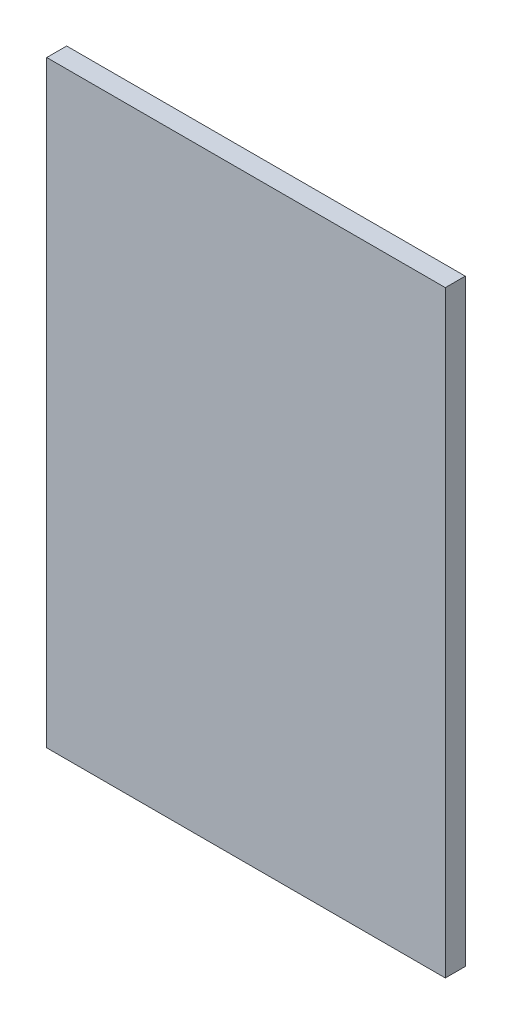
ISO-10303-21;
HEADER;
FILE_DESCRIPTION(('STEP AP214'),'2;1');
FILE_NAME('part.step','',(''),(''),'','','');
FILE_SCHEMA(('AUTOMOTIVE_DESIGN { 1 0 10303 214 1 1 1 1 }'));
ENDSEC;
DATA;
#1=APPLICATION_CONTEXT('core data for automotive mechanical design processes');
#2=APPLICATION_PROTOCOL_DEFINITION('international standard','automotive_design',2000,#1);
#3=PRODUCT_CONTEXT('',#1,'mechanical');
#4=PRODUCT('Part','Part','',(#3));
#5=PRODUCT_RELATED_PRODUCT_CATEGORY('part','',(#4));
#6=PRODUCT_DEFINITION_FORMATION('','',#4);
#7=PRODUCT_DEFINITION_CONTEXT('part definition',#1,'design');
#8=PRODUCT_DEFINITION('design','',#6,#7);
#9=PRODUCT_DEFINITION_SHAPE('','',#8);
#10=(LENGTH_UNIT() NAMED_UNIT(*) SI_UNIT(.MILLI.,.METRE.));
#11=(NAMED_UNIT(*) PLANE_ANGLE_UNIT() SI_UNIT($,.RADIAN.));
#12=(NAMED_UNIT(*) SI_UNIT($,.STERADIAN.) SOLID_ANGLE_UNIT());
#13=UNCERTAINTY_MEASURE_WITH_UNIT(LENGTH_MEASURE(1.E-05),#10,'distance_accuracy_value','');
#14=(GEOMETRIC_REPRESENTATION_CONTEXT(3) GLOBAL_UNCERTAINTY_ASSIGNED_CONTEXT((#13)) GLOBAL_UNIT_ASSIGNED_CONTEXT((#10,
#11,#12)) REPRESENTATION_CONTEXT('',''));
#15=CARTESIAN_POINT('',(0.,0.,0.));
#16=DIRECTION('',(0.,0.,1.));
#17=DIRECTION('',(1.,0.,0.));
#18=AXIS2_PLACEMENT_3D('',#15,#16,#17);
#19=CARTESIAN_POINT('',(-20.,30.,2.));
#20=DIRECTION('',(1.,0.,0.));
#21=DIRECTION('',(0.,0.,-1.));
#22=AXIS2_PLACEMENT_3D('',#19,#20,#21);
#23=PLANE('',#22);
#24=DIRECTION('',(0.,-1.,0.));
#25=VECTOR('',#24,1.);
#26=CARTESIAN_POINT('',(-20.,30.,0.));
#27=LINE('',#26,#25);
#28=CARTESIAN_POINT('',(-20.,30.,0.));
#29=VERTEX_POINT('',#28);
#30=CARTESIAN_POINT('',(-20.,-30.,0.));
#31=VERTEX_POINT('',#30);
#32=EDGE_CURVE('E102',#29,#31,#27,.T.);
#33=ORIENTED_EDGE('',*,*,#32,.T.);
#34=DIRECTION('',(0.,0.,-1.));
#35=VECTOR('',#34,1.);
#36=CARTESIAN_POINT('',(-20.,-30.,2.));
#37=LINE('',#36,#35);
#38=CARTESIAN_POINT('',(-20.,-30.,2.));
#39=VERTEX_POINT('',#38);
#40=EDGE_CURVE('E11',#39,#31,#37,.T.);
#41=ORIENTED_EDGE('',*,*,#40,.F.);
#42=DIRECTION('',(0.,-1.,0.));
#43=VECTOR('',#42,1.);
#44=CARTESIAN_POINT('',(-20.,30.,2.));
#45=LINE('',#44,#43);
#46=CARTESIAN_POINT('',(-20.,30.,2.));
#47=VERTEX_POINT('',#46);
#48=EDGE_CURVE('E90',#47,#39,#45,.T.);
#49=ORIENTED_EDGE('',*,*,#48,.F.);
#50=DIRECTION('',(0.,0.,-1.));
#51=VECTOR('',#50,1.);
#52=CARTESIAN_POINT('',(-20.,30.,2.));
#53=LINE('',#52,#51);
#54=EDGE_CURVE('E98',#47,#29,#53,.T.);
#55=ORIENTED_EDGE('',*,*,#54,.T.);
#56=EDGE_LOOP('',(#33,#41,#49,#55));
#57=FACE_BOUND('',#56,.T.);
#58=ADVANCED_FACE('F39',(#57),#23,.F.);
#59=CARTESIAN_POINT('',(-20.,-30.,2.));
#60=DIRECTION('',(0.,1.,0.));
#61=DIRECTION('',(0.,0.,1.));
#62=AXIS2_PLACEMENT_3D('',#59,#60,#61);
#63=PLANE('',#62);
#64=DIRECTION('',(1.,0.,0.));
#65=VECTOR('',#64,1.);
#66=CARTESIAN_POINT('',(-20.,-30.,0.));
#67=LINE('',#66,#65);
#68=CARTESIAN_POINT('',(20.,-30.,0.));
#69=VERTEX_POINT('',#68);
#70=EDGE_CURVE('E94',#31,#69,#67,.T.);
#71=ORIENTED_EDGE('',*,*,#70,.T.);
#72=DIRECTION('',(0.,0.,-1.));
#73=VECTOR('',#72,1.);
#74=CARTESIAN_POINT('',(20.,-30.,2.));
#75=LINE('',#74,#73);
#76=CARTESIAN_POINT('',(20.,-30.,2.));
#77=VERTEX_POINT('',#76);
#78=EDGE_CURVE('E47',#77,#69,#75,.T.);
#79=ORIENTED_EDGE('',*,*,#78,.F.);
#80=DIRECTION('',(1.,0.,0.));
#81=VECTOR('',#80,1.);
#82=CARTESIAN_POINT('',(-20.,-30.,2.));
#83=LINE('',#82,#81);
#84=EDGE_CURVE('E85',#39,#77,#83,.T.);
#85=ORIENTED_EDGE('',*,*,#84,.F.);
#86=ORIENTED_EDGE('',*,*,#40,.T.);
#87=EDGE_LOOP('',(#71,#79,#85,#86));
#88=FACE_BOUND('',#87,.T.);
#89=ADVANCED_FACE('F93',(#88),#63,.F.);
#90=CARTESIAN_POINT('',(20.,-30.,2.));
#91=DIRECTION('',(-1.,0.,0.));
#92=DIRECTION('',(0.,0.,1.));
#93=AXIS2_PLACEMENT_3D('',#90,#91,#92);
#94=PLANE('',#93);
#95=DIRECTION('',(0.,1.,0.));
#96=VECTOR('',#95,1.);
#97=CARTESIAN_POINT('',(20.,-30.,0.));
#98=LINE('',#97,#96);
#99=CARTESIAN_POINT('',(20.,30.,0.));
#100=VERTEX_POINT('',#99);
#101=EDGE_CURVE('E72',#69,#100,#98,.T.);
#102=ORIENTED_EDGE('',*,*,#101,.T.);
#103=DIRECTION('',(0.,0.,-1.));
#104=VECTOR('',#103,1.);
#105=CARTESIAN_POINT('',(20.,30.,2.));
#106=LINE('',#105,#104);
#107=CARTESIAN_POINT('',(20.,30.,2.));
#108=VERTEX_POINT('',#107);
#109=EDGE_CURVE('E95',#108,#100,#106,.T.);
#110=ORIENTED_EDGE('',*,*,#109,.F.);
#111=DIRECTION('',(0.,1.,0.));
#112=VECTOR('',#111,1.);
#113=CARTESIAN_POINT('',(20.,-30.,2.));
#114=LINE('',#113,#112);
#115=EDGE_CURVE('E88',#77,#108,#114,.T.);
#116=ORIENTED_EDGE('',*,*,#115,.F.);
#117=ORIENTED_EDGE('',*,*,#78,.T.);
#118=EDGE_LOOP('',(#102,#110,#116,#117));
#119=FACE_BOUND('',#118,.T.);
#120=ADVANCED_FACE('F96',(#119),#94,.F.);
#121=CARTESIAN_POINT('',(20.,30.,2.));
#122=DIRECTION('',(0.,-1.,0.));
#123=DIRECTION('',(0.,0.,-1.));
#124=AXIS2_PLACEMENT_3D('',#121,#122,#123);
#125=PLANE('',#124);
#126=DIRECTION('',(-1.,0.,0.));
#127=VECTOR('',#126,1.);
#128=CARTESIAN_POINT('',(20.,30.,0.));
#129=LINE('',#128,#127);
#130=EDGE_CURVE('E78',#100,#29,#129,.T.);
#131=ORIENTED_EDGE('',*,*,#130,.T.);
#132=ORIENTED_EDGE('',*,*,#54,.F.);
#133=DIRECTION('',(-1.,0.,0.));
#134=VECTOR('',#133,1.);
#135=CARTESIAN_POINT('',(20.,30.,2.));
#136=LINE('',#135,#134);
#137=EDGE_CURVE('E55',#108,#47,#136,.T.);
#138=ORIENTED_EDGE('',*,*,#137,.F.);
#139=ORIENTED_EDGE('',*,*,#109,.T.);
#140=EDGE_LOOP('',(#131,#132,#138,#139));
#141=FACE_BOUND('',#140,.T.);
#142=ADVANCED_FACE('F109',(#141),#125,.F.);
#143=CARTESIAN_POINT('',(0.,0.,2.));
#144=DIRECTION('',(0.,0.,1.));
#145=DIRECTION('',(1.,0.,0.));
#146=AXIS2_PLACEMENT_3D('',#143,#144,#145);
#147=PLANE('',#146);
#148=ORIENTED_EDGE('',*,*,#48,.T.);
#149=ORIENTED_EDGE('',*,*,#84,.T.);
#150=ORIENTED_EDGE('',*,*,#115,.T.);
#151=ORIENTED_EDGE('',*,*,#137,.T.);
#152=EDGE_LOOP('',(#148,#149,#150,#151));
#153=FACE_BOUND('',#152,.T.);
#154=ADVANCED_FACE('F86',(#153),#147,.T.);
#155=CARTESIAN_POINT('',(0.,0.,0.));
#156=DIRECTION('',(0.,0.,1.));
#157=DIRECTION('',(1.,0.,0.));
#158=AXIS2_PLACEMENT_3D('',#155,#156,#157);
#159=PLANE('',#158);
#160=ORIENTED_EDGE('',*,*,#32,.F.);
#161=ORIENTED_EDGE('',*,*,#130,.F.);
#162=ORIENTED_EDGE('',*,*,#101,.F.);
#163=ORIENTED_EDGE('',*,*,#70,.F.);
#164=EDGE_LOOP('',(#160,#161,#162,#163));
#165=FACE_BOUND('',#164,.T.);
#166=ADVANCED_FACE('F112',(#165),#159,.F.);
#167=CLOSED_SHELL('',(#58,#89,#120,#142,#154,#166));
#168=MANIFOLD_SOLID_BREP('B2',#167);
#169=ADVANCED_BREP_SHAPE_REPRESENTATION('',(#18,#168),#14);
#170=SHAPE_DEFINITION_REPRESENTATION(#9,#169);
ENDSEC;
END-ISO-10303-21;
